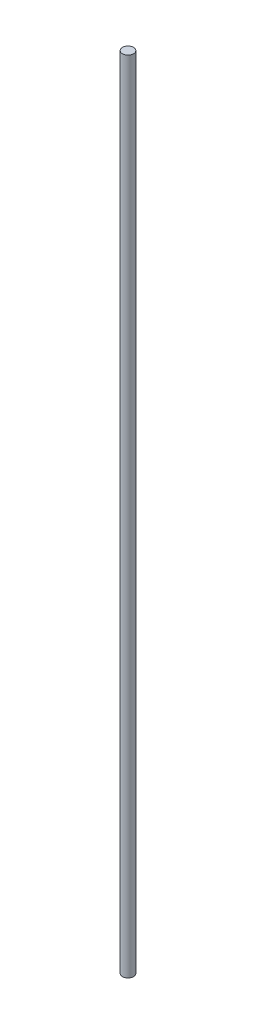
ISO-10303-21;
HEADER;
FILE_DESCRIPTION(('STEP AP214'),'2;1');
FILE_NAME('part.step','',(''),(''),'','','');
FILE_SCHEMA(('AUTOMOTIVE_DESIGN { 1 0 10303 214 1 1 1 1 }'));
ENDSEC;
DATA;
#1=APPLICATION_CONTEXT('core data for automotive mechanical design processes');
#2=APPLICATION_PROTOCOL_DEFINITION('international standard','automotive_design',2000,#1);
#3=PRODUCT_CONTEXT('',#1,'mechanical');
#4=PRODUCT('Part','Part','',(#3));
#5=PRODUCT_RELATED_PRODUCT_CATEGORY('part','',(#4));
#6=PRODUCT_DEFINITION_FORMATION('','',#4);
#7=PRODUCT_DEFINITION_CONTEXT('part definition',#1,'design');
#8=PRODUCT_DEFINITION('design','',#6,#7);
#9=PRODUCT_DEFINITION_SHAPE('','',#8);
#10=(LENGTH_UNIT() NAMED_UNIT(*) SI_UNIT(.MILLI.,.METRE.));
#11=(NAMED_UNIT(*) PLANE_ANGLE_UNIT() SI_UNIT($,.RADIAN.));
#12=(NAMED_UNIT(*) SI_UNIT($,.STERADIAN.) SOLID_ANGLE_UNIT());
#13=UNCERTAINTY_MEASURE_WITH_UNIT(LENGTH_MEASURE(1.E-05),#10,'distance_accuracy_value','');
#14=(GEOMETRIC_REPRESENTATION_CONTEXT(3) GLOBAL_UNCERTAINTY_ASSIGNED_CONTEXT((#13)) GLOBAL_UNIT_ASSIGNED_CONTEXT((#10,
#11,#12)) REPRESENTATION_CONTEXT('',''));
#15=CARTESIAN_POINT('',(0.,0.,0.));
#16=DIRECTION('',(0.,0.,1.));
#17=DIRECTION('',(1.,0.,0.));
#18=AXIS2_PLACEMENT_3D('',#15,#16,#17);
#19=CARTESIAN_POINT('',(0.,-180.,0.));
#20=DIRECTION('',(0.,1.,0.));
#21=DIRECTION('',(0.,0.,1.));
#22=AXIS2_PLACEMENT_3D('',#19,#20,#21);
#23=CYLINDRICAL_SURFACE('',#22,2.5);
#24=CARTESIAN_POINT('',(0.,-180.,0.));
#25=DIRECTION('',(0.,1.,0.));
#26=DIRECTION('',(0.,0.,1.));
#27=AXIS2_PLACEMENT_3D('',#24,#25,#26);
#28=CIRCLE('',#27,2.5);
#29=CARTESIAN_POINT('',(0.,-180.,2.5));
#30=VERTEX_POINT('',#29);
#31=EDGE_CURVE('E10',#30,#30,#28,.T.);
#32=CARTESIAN_POINT('',(0.,180.,0.));
#33=DIRECTION('',(0.,1.,0.));
#34=DIRECTION('',(0.,0.,1.));
#35=AXIS2_PLACEMENT_3D('',#32,#33,#34);
#36=CIRCLE('',#35,2.5);
#37=CARTESIAN_POINT('',(0.,180.,2.5));
#38=VERTEX_POINT('',#37);
#39=EDGE_CURVE('E46',#38,#38,#36,.T.);
#40=CARTESIAN_POINT('',(0.,-180.,2.5));
#41=CARTESIAN_POINT('',(0.,-176.25,2.5));
#42=CARTESIAN_POINT('',(0.,-172.5,2.5));
#43=CARTESIAN_POINT('',(0.,-165.,2.5));
#44=CARTESIAN_POINT('',(0.,-161.25,2.5));
#45=CARTESIAN_POINT('',(0.,-153.75,2.5));
#46=CARTESIAN_POINT('',(0.,-150.,2.5));
#47=CARTESIAN_POINT('',(0.,-142.5,2.5));
#48=CARTESIAN_POINT('',(0.,-138.75,2.5));
#49=CARTESIAN_POINT('',(0.,-131.25,2.5));
#50=CARTESIAN_POINT('',(0.,-127.5,2.5));
#51=CARTESIAN_POINT('',(0.,-120.,2.5));
#52=CARTESIAN_POINT('',(0.,-116.25,2.5));
#53=CARTESIAN_POINT('',(0.,-108.75,2.5));
#54=CARTESIAN_POINT('',(0.,-105.,2.5));
#55=CARTESIAN_POINT('',(0.,-97.5,2.5));
#56=CARTESIAN_POINT('',(0.,-93.75,2.5));
#57=CARTESIAN_POINT('',(0.,-86.25,2.5));
#58=CARTESIAN_POINT('',(0.,-82.5,2.5));
#59=CARTESIAN_POINT('',(0.,-75.,2.5));
#60=CARTESIAN_POINT('',(0.,-71.25,2.5));
#61=CARTESIAN_POINT('',(0.,-63.75,2.5));
#62=CARTESIAN_POINT('',(0.,-60.,2.5));
#63=CARTESIAN_POINT('',(0.,-52.5,2.5));
#64=CARTESIAN_POINT('',(0.,-48.75,2.5));
#65=CARTESIAN_POINT('',(0.,-41.25,2.5));
#66=CARTESIAN_POINT('',(0.,-37.5,2.5));
#67=CARTESIAN_POINT('',(0.,-30.,2.5));
#68=CARTESIAN_POINT('',(0.,-26.25,2.5));
#69=CARTESIAN_POINT('',(0.,-18.75,2.5));
#70=CARTESIAN_POINT('',(0.,-15.,2.5));
#71=CARTESIAN_POINT('',(0.,-7.50000000000003,2.5));
#72=CARTESIAN_POINT('',(0.,-3.75000000000003,2.5));
#73=CARTESIAN_POINT('',(0.,3.74999999999998,2.5));
#74=CARTESIAN_POINT('',(0.,7.49999999999998,2.5));
#75=CARTESIAN_POINT('',(0.,15.,2.5));
#76=CARTESIAN_POINT('',(0.,18.75,2.5));
#77=CARTESIAN_POINT('',(0.,26.25,2.5));
#78=CARTESIAN_POINT('',(0.,30.,2.5));
#79=CARTESIAN_POINT('',(0.,37.5,2.5));
#80=CARTESIAN_POINT('',(0.,41.25,2.5));
#81=CARTESIAN_POINT('',(0.,48.75,2.5));
#82=CARTESIAN_POINT('',(0.,52.5,2.5));
#83=CARTESIAN_POINT('',(0.,60.,2.5));
#84=CARTESIAN_POINT('',(0.,63.75,2.5));
#85=CARTESIAN_POINT('',(0.,71.25,2.5));
#86=CARTESIAN_POINT('',(0.,74.9999999999999,2.5));
#87=CARTESIAN_POINT('',(0.,82.4999999999999,2.5));
#88=CARTESIAN_POINT('',(0.,86.25,2.5));
#89=CARTESIAN_POINT('',(0.,93.75,2.5));
#90=CARTESIAN_POINT('',(0.,97.5,2.5));
#91=CARTESIAN_POINT('',(0.,105.,2.5));
#92=CARTESIAN_POINT('',(0.,108.75,2.5));
#93=CARTESIAN_POINT('',(0.,116.25,2.5));
#94=CARTESIAN_POINT('',(0.,120.,2.5));
#95=CARTESIAN_POINT('',(0.,127.5,2.5));
#96=CARTESIAN_POINT('',(0.,131.25,2.5));
#97=CARTESIAN_POINT('',(0.,138.75,2.5));
#98=CARTESIAN_POINT('',(0.,142.5,2.5));
#99=CARTESIAN_POINT('',(0.,150.,2.5));
#100=CARTESIAN_POINT('',(0.,153.75,2.5));
#101=CARTESIAN_POINT('',(0.,161.25,2.5));
#102=CARTESIAN_POINT('',(0.,165.,2.5));
#103=CARTESIAN_POINT('',(0.,172.5,2.5));
#104=CARTESIAN_POINT('',(0.,176.25,2.5));
#105=CARTESIAN_POINT('',(0.,180.,2.5));
#106=B_SPLINE_CURVE_WITH_KNOTS('',3,(#40,#41,#42,#43,#44,#45,#46,#47,#48,#49,#50,#51,#52,#53,
#54,#55,#56,#57,#58,#59,#60,#61,#62,#63,#64,#65,#66,#67,#68,#69,#70,#71,#72,#73,#74,#75,#76,#77,
#78,#79,#80,#81,#82,#83,#84,#85,#86,#87,#88,#89,#90,#91,#92,#93,#94,#95,#96,#97,#98,#99,#100,
#101,#102,#103,#104,#105),.UNSPECIFIED.,.F.,.F.,(4,2,2,2,2,2,2,2,2,2,2,2,2,2,2,2,2,2,2,2,2,2,2,
2,2,2,2,2,2,2,2,2,4),(0.,11.25,22.5,33.75,45.,56.25,67.5,78.75,90.,101.25,112.5,123.75,135.,
146.25,157.5,168.75,180.,191.25,202.5,213.75,225.,236.25,247.5,258.75,270.,281.25,292.5,303.75,
315.,326.25,337.5,348.75,360.),.UNSPECIFIED.);
#107=EDGE_CURVE('BSEAM40',#30,#38,#106,.T.);
#108=ORIENTED_EDGE('',*,*,#31,.T.);
#109=ORIENTED_EDGE('',*,*,#39,.F.);
#110=ORIENTED_EDGE('',*,*,#107,.T.);
#111=ORIENTED_EDGE('',*,*,#107,.F.);
#112=EDGE_LOOP('',(#108,#110,#109,#111));
#113=FACE_BOUND('',#112,.T.);
#114=ADVANCED_FACE('F40',(#113),#23,.T.);
#115=CARTESIAN_POINT('',(0.,-180.,0.));
#116=DIRECTION('',(0.,1.,0.));
#117=DIRECTION('',(0.,0.,1.));
#118=AXIS2_PLACEMENT_3D('',#115,#116,#117);
#119=PLANE('',#118);
#120=ORIENTED_EDGE('',*,*,#31,.F.);
#121=EDGE_LOOP('',(#120));
#122=FACE_BOUND('',#121,.T.);
#123=ADVANCED_FACE('F55',(#122),#119,.F.);
#124=CARTESIAN_POINT('',(0.,180.,0.));
#125=DIRECTION('',(0.,1.,0.));
#126=DIRECTION('',(0.,0.,1.));
#127=AXIS2_PLACEMENT_3D('',#124,#125,#126);
#128=PLANE('',#127);
#129=ORIENTED_EDGE('',*,*,#39,.T.);
#130=EDGE_LOOP('',(#129));
#131=FACE_BOUND('',#130,.T.);
#132=ADVANCED_FACE('F52',(#131),#128,.T.);
#133=CLOSED_SHELL('',(#114,#123,#132));
#134=MANIFOLD_SOLID_BREP('B2',#133);
#135=ADVANCED_BREP_SHAPE_REPRESENTATION('',(#18,#134),#14);
#136=SHAPE_DEFINITION_REPRESENTATION(#9,#135);
ENDSEC;
END-ISO-10303-21;
